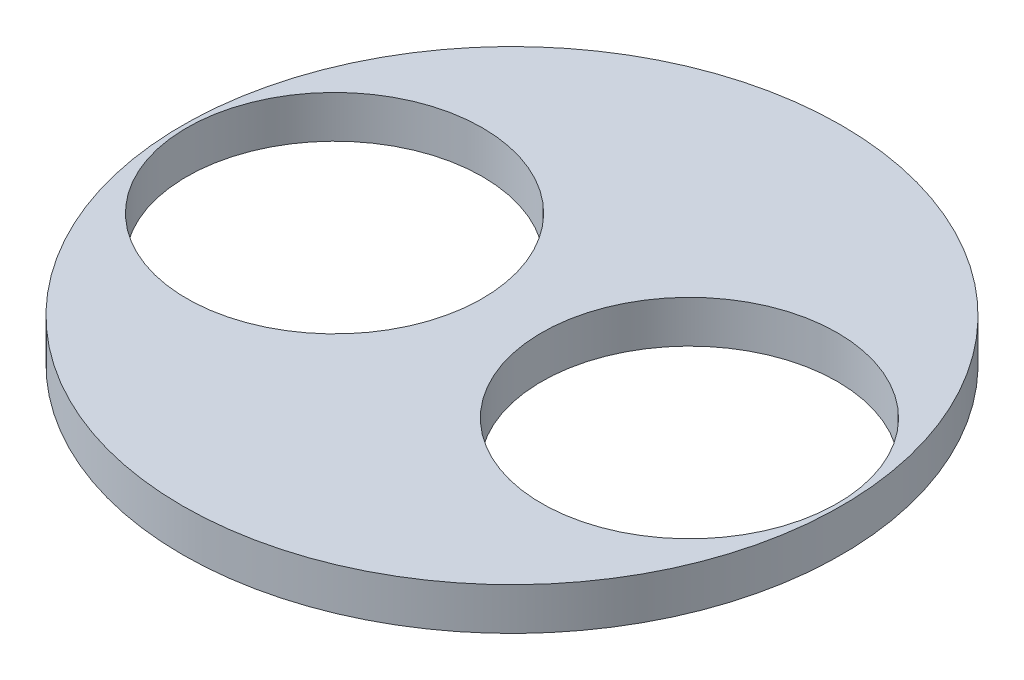
ISO-10303-21;
HEADER;
FILE_DESCRIPTION(('STEP AP214'),'2;1');
FILE_NAME('part.step','',(''),(''),'','','');
FILE_SCHEMA(('AUTOMOTIVE_DESIGN { 1 0 10303 214 1 1 1 1 }'));
ENDSEC;
DATA;
#1=APPLICATION_CONTEXT('core data for automotive mechanical design processes');
#2=APPLICATION_PROTOCOL_DEFINITION('international standard','automotive_design',2000,#1);
#3=PRODUCT_CONTEXT('',#1,'mechanical');
#4=PRODUCT('Part','Part','',(#3));
#5=PRODUCT_RELATED_PRODUCT_CATEGORY('part','',(#4));
#6=PRODUCT_DEFINITION_FORMATION('','',#4);
#7=PRODUCT_DEFINITION_CONTEXT('part definition',#1,'design');
#8=PRODUCT_DEFINITION('design','',#6,#7);
#9=PRODUCT_DEFINITION_SHAPE('','',#8);
#10=(LENGTH_UNIT() NAMED_UNIT(*) SI_UNIT(.MILLI.,.METRE.));
#11=(NAMED_UNIT(*) PLANE_ANGLE_UNIT() SI_UNIT($,.RADIAN.));
#12=(NAMED_UNIT(*) SI_UNIT($,.STERADIAN.) SOLID_ANGLE_UNIT());
#13=UNCERTAINTY_MEASURE_WITH_UNIT(LENGTH_MEASURE(1.E-05),#10,'distance_accuracy_value','');
#14=(GEOMETRIC_REPRESENTATION_CONTEXT(3) GLOBAL_UNCERTAINTY_ASSIGNED_CONTEXT((#13)) GLOBAL_UNIT_ASSIGNED_CONTEXT((#10,
#11,#12)) REPRESENTATION_CONTEXT('',''));
#15=CARTESIAN_POINT('',(0.,0.,0.));
#16=DIRECTION('',(0.,0.,1.));
#17=DIRECTION('',(1.,0.,0.));
#18=AXIS2_PLACEMENT_3D('',#15,#16,#17);
#19=CARTESIAN_POINT('',(0.,6.35,0.));
#20=DIRECTION('',(0.,-1.,0.));
#21=DIRECTION('',(0.,0.,-1.));
#22=AXIS2_PLACEMENT_3D('',#19,#20,#21);
#23=CYLINDRICAL_SURFACE('',#22,49.53);
#24=CARTESIAN_POINT('',(0.,6.35,0.));
#25=DIRECTION('',(0.,1.,0.));
#26=DIRECTION('',(0.,0.,1.));
#27=AXIS2_PLACEMENT_3D('',#24,#25,#26);
#28=CIRCLE('',#27,49.53);
#29=CARTESIAN_POINT('',(0.,6.35,49.53));
#30=VERTEX_POINT('',#29);
#31=EDGE_CURVE('E10',#30,#30,#28,.T.);
#32=ORIENTED_EDGE('',*,*,#31,.F.);
#33=EDGE_LOOP('',(#32));
#34=FACE_BOUND('',#33,.T.);
#35=CARTESIAN_POINT('',(0.,0.,0.));
#36=DIRECTION('',(0.,1.,0.));
#37=DIRECTION('',(0.,0.,1.));
#38=AXIS2_PLACEMENT_3D('',#35,#36,#37);
#39=CIRCLE('',#38,49.53);
#40=CARTESIAN_POINT('',(0.,0.,49.53));
#41=VERTEX_POINT('',#40);
#42=EDGE_CURVE('E46',#41,#41,#39,.T.);
#43=ORIENTED_EDGE('',*,*,#42,.T.);
#44=EDGE_LOOP('',(#43));
#45=FACE_BOUND('',#44,.T.);
#46=ADVANCED_FACE('F43',(#34,#45),#23,.T.);
#47=CARTESIAN_POINT('',(0.,6.35,0.));
#48=DIRECTION('',(0.,1.,0.));
#49=DIRECTION('',(0.,0.,1.));
#50=AXIS2_PLACEMENT_3D('',#47,#48,#49);
#51=PLANE('',#50);
#52=CARTESIAN_POINT('',(-26.67,6.35,0.));
#53=DIRECTION('',(0.,-1.,0.));
#54=DIRECTION('',(0.,0.,-1.));
#55=AXIS2_PLACEMENT_3D('',#52,#53,#54);
#56=CIRCLE('',#55,22.225);
#57=CARTESIAN_POINT('',(-26.67,6.35,-22.225));
#58=VERTEX_POINT('',#57);
#59=EDGE_CURVE('E52',#58,#58,#56,.T.);
#60=ORIENTED_EDGE('',*,*,#59,.T.);
#61=EDGE_LOOP('',(#60));
#62=FACE_BOUND('',#61,.T.);
#63=CARTESIAN_POINT('',(26.67,6.35,0.));
#64=DIRECTION('',(0.,-1.,0.));
#65=DIRECTION('',(0.,0.,-1.));
#66=AXIS2_PLACEMENT_3D('',#63,#64,#65);
#67=CIRCLE('',#66,22.225);
#68=CARTESIAN_POINT('',(26.67,6.35,-22.225));
#69=VERTEX_POINT('',#68);
#70=EDGE_CURVE('E54',#69,#69,#67,.T.);
#71=ORIENTED_EDGE('',*,*,#70,.T.);
#72=EDGE_LOOP('',(#71));
#73=FACE_BOUND('',#72,.T.);
#74=ORIENTED_EDGE('',*,*,#31,.T.);
#75=EDGE_LOOP('',(#74));
#76=FACE_BOUND('',#75,.T.);
#77=ADVANCED_FACE('F70',(#62,#73,#76),#51,.T.);
#78=CARTESIAN_POINT('',(0.,0.,0.));
#79=DIRECTION('',(0.,1.,0.));
#80=DIRECTION('',(0.,0.,1.));
#81=AXIS2_PLACEMENT_3D('',#78,#79,#80);
#82=PLANE('',#81);
#83=CARTESIAN_POINT('',(-26.67,0.,0.));
#84=DIRECTION('',(0.,-1.,0.));
#85=DIRECTION('',(0.,0.,-1.));
#86=AXIS2_PLACEMENT_3D('',#83,#84,#85);
#87=CIRCLE('',#86,22.225);
#88=CARTESIAN_POINT('',(-26.67,0.,-22.225));
#89=VERTEX_POINT('',#88);
#90=EDGE_CURVE('E62',#89,#89,#87,.T.);
#91=ORIENTED_EDGE('',*,*,#90,.F.);
#92=EDGE_LOOP('',(#91));
#93=FACE_BOUND('',#92,.T.);
#94=CARTESIAN_POINT('',(26.67,0.,0.));
#95=DIRECTION('',(0.,-1.,0.));
#96=DIRECTION('',(0.,0.,-1.));
#97=AXIS2_PLACEMENT_3D('',#94,#95,#96);
#98=CIRCLE('',#97,22.225);
#99=CARTESIAN_POINT('',(26.67,0.,-22.225));
#100=VERTEX_POINT('',#99);
#101=EDGE_CURVE('E59',#100,#100,#98,.T.);
#102=ORIENTED_EDGE('',*,*,#101,.F.);
#103=EDGE_LOOP('',(#102));
#104=FACE_BOUND('',#103,.T.);
#105=ORIENTED_EDGE('',*,*,#42,.F.);
#106=EDGE_LOOP('',(#105));
#107=FACE_BOUND('',#106,.T.);
#108=ADVANCED_FACE('F80',(#93,#104,#107),#82,.F.);
#109=CARTESIAN_POINT('',(26.67,6.35,0.));
#110=DIRECTION('',(0.,-1.,0.));
#111=DIRECTION('',(0.,0.,-1.));
#112=AXIS2_PLACEMENT_3D('',#109,#110,#111);
#113=CYLINDRICAL_SURFACE('',#112,22.225);
#114=ORIENTED_EDGE('',*,*,#70,.F.);
#115=EDGE_LOOP('',(#114));
#116=FACE_BOUND('',#115,.T.);
#117=ORIENTED_EDGE('',*,*,#101,.T.);
#118=EDGE_LOOP('',(#117));
#119=FACE_BOUND('',#118,.T.);
#120=ADVANCED_FACE('F71',(#116,#119),#113,.F.);
#121=CARTESIAN_POINT('',(-26.67,6.35,0.));
#122=DIRECTION('',(0.,-1.,0.));
#123=DIRECTION('',(0.,0.,-1.));
#124=AXIS2_PLACEMENT_3D('',#121,#122,#123);
#125=CYLINDRICAL_SURFACE('',#124,22.225);
#126=ORIENTED_EDGE('',*,*,#59,.F.);
#127=EDGE_LOOP('',(#126));
#128=FACE_BOUND('',#127,.T.);
#129=ORIENTED_EDGE('',*,*,#90,.T.);
#130=EDGE_LOOP('',(#129));
#131=FACE_BOUND('',#130,.T.);
#132=ADVANCED_FACE('F69',(#128,#131),#125,.F.);
#133=CLOSED_SHELL('',(#46,#77,#108,#120,#132));
#134=MANIFOLD_SOLID_BREP('B2',#133);
#135=ADVANCED_BREP_SHAPE_REPRESENTATION('',(#18,#134),#14);
#136=SHAPE_DEFINITION_REPRESENTATION(#9,#135);
ENDSEC;
END-ISO-10303-21;
